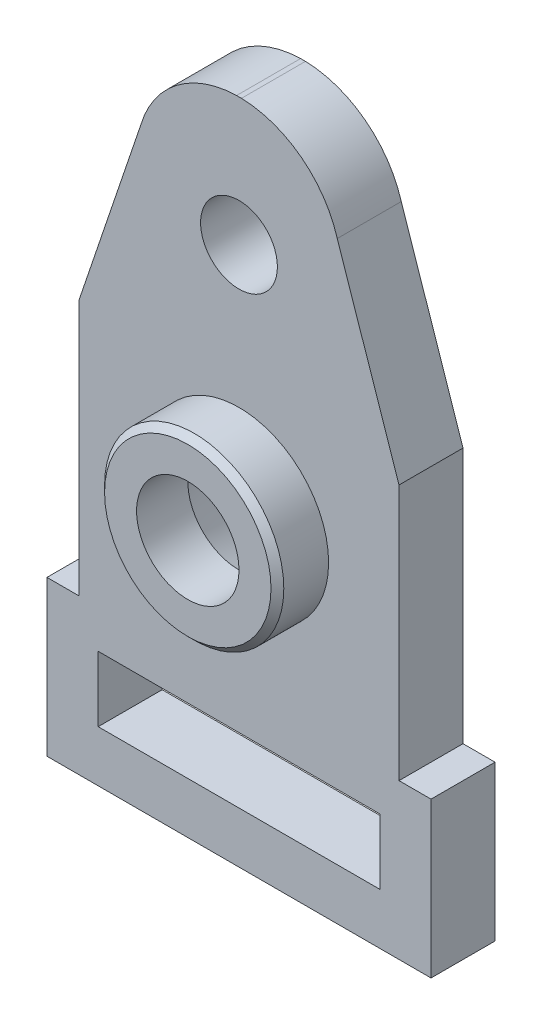
ISO-10303-21;
HEADER;
FILE_DESCRIPTION(('STEP AP214'),'2;1');
FILE_NAME('part.step','',(''),(''),'','','');
FILE_SCHEMA(('AUTOMOTIVE_DESIGN { 1 0 10303 214 1 1 1 1 }'));
ENDSEC;
DATA;
#1=APPLICATION_CONTEXT('core data for automotive mechanical design processes');
#2=APPLICATION_PROTOCOL_DEFINITION('international standard','automotive_design',2000,#1);
#3=PRODUCT_CONTEXT('',#1,'mechanical');
#4=PRODUCT('Part','Part','',(#3));
#5=PRODUCT_RELATED_PRODUCT_CATEGORY('part','',(#4));
#6=PRODUCT_DEFINITION_FORMATION('','',#4);
#7=PRODUCT_DEFINITION_CONTEXT('part definition',#1,'design');
#8=PRODUCT_DEFINITION('design','',#6,#7);
#9=PRODUCT_DEFINITION_SHAPE('','',#8);
#10=(LENGTH_UNIT() NAMED_UNIT(*) SI_UNIT(.MILLI.,.METRE.));
#11=(NAMED_UNIT(*) PLANE_ANGLE_UNIT() SI_UNIT($,.RADIAN.));
#12=(NAMED_UNIT(*) SI_UNIT($,.STERADIAN.) SOLID_ANGLE_UNIT());
#13=UNCERTAINTY_MEASURE_WITH_UNIT(LENGTH_MEASURE(1.E-05),#10,'distance_accuracy_value','');
#14=(GEOMETRIC_REPRESENTATION_CONTEXT(3) GLOBAL_UNCERTAINTY_ASSIGNED_CONTEXT((#13)) GLOBAL_UNIT_ASSIGNED_CONTEXT((#10,
#11,#12)) REPRESENTATION_CONTEXT('',''));
#15=CARTESIAN_POINT('',(0.,0.,0.));
#16=DIRECTION('',(0.,0.,1.));
#17=DIRECTION('',(1.,0.,0.));
#18=AXIS2_PLACEMENT_3D('',#15,#16,#17);
#19=CARTESIAN_POINT('',(0.,0.,5.));
#20=DIRECTION('',(0.,0.,1.));
#21=DIRECTION('',(1.,0.,0.));
#22=AXIS2_PLACEMENT_3D('',#19,#20,#21);
#23=PLANE('',#22);
#24=CARTESIAN_POINT('',(0.,10.,5.));
#25=DIRECTION('',(0.,0.,1.));
#26=DIRECTION('',(1.,0.,0.));
#27=AXIS2_PLACEMENT_3D('',#24,#25,#26);
#28=CIRCLE('',#27,3.);
#29=CARTESIAN_POINT('',(3.,10.,5.));
#30=VERTEX_POINT('',#29);
#31=EDGE_CURVE('E252',#30,#30,#28,.T.);
#32=ORIENTED_EDGE('',*,*,#31,.F.);
#33=EDGE_LOOP('',(#32));
#34=FACE_BOUND('',#33,.T.);
#35=DIRECTION('',(-1.,0.,0.));
#36=VECTOR('',#35,1.);
#37=CARTESIAN_POINT('',(0.,-32.1,5.));
#38=LINE('',#37,#36);
#39=CARTESIAN_POINT('',(15.,-32.1,5.));
#40=VERTEX_POINT('',#39);
#41=CARTESIAN_POINT('',(-15.,-32.1,5.));
#42=VERTEX_POINT('',#41);
#43=EDGE_CURVE('E218',#40,#42,#38,.T.);
#44=ORIENTED_EDGE('',*,*,#43,.F.);
#45=DIRECTION('',(0.,-1.,0.));
#46=VECTOR('',#45,1.);
#47=CARTESIAN_POINT('',(15.,0.,5.));
#48=LINE('',#47,#46);
#49=CARTESIAN_POINT('',(15.,-20.,5.));
#50=VERTEX_POINT('',#49);
#51=EDGE_CURVE('E349',#50,#40,#48,.T.);
#52=ORIENTED_EDGE('',*,*,#51,.F.);
#53=DIRECTION('',(-1.,0.,0.));
#54=VECTOR('',#53,1.);
#55=CARTESIAN_POINT('',(0.,-20.,5.));
#56=LINE('',#55,#54);
#57=CARTESIAN_POINT('',(12.5,-20.,5.));
#58=VERTEX_POINT('',#57);
#59=EDGE_CURVE('E350',#50,#58,#56,.T.);
#60=ORIENTED_EDGE('',*,*,#59,.T.);
#61=DIRECTION('',(0.,-1.,0.));
#62=VECTOR('',#61,1.);
#63=CARTESIAN_POINT('',(12.5,0.,5.));
#64=LINE('',#63,#62);
#65=CARTESIAN_POINT('',(12.5,0.,5.));
#66=VERTEX_POINT('',#65);
#67=EDGE_CURVE('E352',#66,#58,#64,.T.);
#68=ORIENTED_EDGE('',*,*,#67,.F.);
#69=DIRECTION('',(-0.32052102488142,0.947241401443668,0.));
#70=VECTOR('',#69,1.);
#71=CARTESIAN_POINT('',(11.215828407612,3.79513481001046,5.));
#72=LINE('',#71,#70);
#73=CARTESIAN_POINT('',(7.67486774506854,14.2597979056233,5.));
#74=VERTEX_POINT('',#73);
#75=EDGE_CURVE('E360',#66,#74,#72,.T.);
#76=ORIENTED_EDGE('',*,*,#75,.T.);
#77=CARTESIAN_POINT('',(0.,12.0022760129927,5.));
#78=DIRECTION('',(0.,0.,1.));
#79=DIRECTION('',(1.,0.,0.));
#80=AXIS2_PLACEMENT_3D('',#77,#78,#79);
#81=CIRCLE('',#80,8.);
#82=CARTESIAN_POINT('',(0.190816738386861,20.,5.));
#83=VERTEX_POINT('',#82);
#84=EDGE_CURVE('E362',#74,#83,#81,.T.);
#85=ORIENTED_EDGE('',*,*,#84,.T.);
#86=DIRECTION('',(-1.,0.,0.));
#87=VECTOR('',#86,1.);
#88=CARTESIAN_POINT('',(0.,20.,5.));
#89=LINE('',#88,#87);
#90=CARTESIAN_POINT('',(-0.190816738386866,20.,5.));
#91=VERTEX_POINT('',#90);
#92=EDGE_CURVE('E364',#83,#91,#89,.T.);
#93=ORIENTED_EDGE('',*,*,#92,.T.);
#94=CARTESIAN_POINT('',(-7.67486774506853,14.2597979056234,5.));
#95=VERTEX_POINT('',#94);
#96=EDGE_CURVE('E365',#91,#95,#81,.T.);
#97=ORIENTED_EDGE('',*,*,#96,.T.);
#98=DIRECTION('',(0.32052102488142,0.947241401443668,0.));
#99=VECTOR('',#98,1.);
#100=CARTESIAN_POINT('',(-11.2158284076121,3.79513481001046,5.));
#101=LINE('',#100,#99);
#102=CARTESIAN_POINT('',(-12.5,0.,5.));
#103=VERTEX_POINT('',#102);
#104=EDGE_CURVE('E367',#103,#95,#101,.T.);
#105=ORIENTED_EDGE('',*,*,#104,.F.);
#106=DIRECTION('',(0.,-1.,0.));
#107=VECTOR('',#106,1.);
#108=CARTESIAN_POINT('',(-12.5,0.,5.));
#109=LINE('',#108,#107);
#110=CARTESIAN_POINT('',(-12.5,-20.,5.));
#111=VERTEX_POINT('',#110);
#112=EDGE_CURVE('E370',#103,#111,#109,.T.);
#113=ORIENTED_EDGE('',*,*,#112,.T.);
#114=CARTESIAN_POINT('',(-15.,-20.,5.));
#115=VERTEX_POINT('',#114);
#116=EDGE_CURVE('E354',#111,#115,#56,.T.);
#117=ORIENTED_EDGE('',*,*,#116,.T.);
#118=DIRECTION('',(0.,-1.,0.));
#119=VECTOR('',#118,1.);
#120=CARTESIAN_POINT('',(-15.,0.,5.));
#121=LINE('',#120,#119);
#122=EDGE_CURVE('E372',#115,#42,#121,.T.);
#123=ORIENTED_EDGE('',*,*,#122,.T.);
#124=EDGE_LOOP('',(#44,#52,#60,#68,#76,#85,#93,#97,#105,#113,#117,#123));
#125=FACE_BOUND('',#124,.T.);
#126=DIRECTION('',(0.,-1.,0.));
#127=VECTOR('',#126,1.);
#128=CARTESIAN_POINT('',(11.0000000000005,-2.24493626302891E-13,5.));
#129=LINE('',#128,#127);
#130=CARTESIAN_POINT('',(11.,-23.,5.));
#131=VERTEX_POINT('',#130);
#132=CARTESIAN_POINT('',(11.,-28.1,5.));
#133=VERTEX_POINT('',#132);
#134=EDGE_CURVE('E173',#131,#133,#129,.T.);
#135=ORIENTED_EDGE('',*,*,#134,.T.);
#136=DIRECTION('',(1.,0.,0.));
#137=VECTOR('',#136,1.);
#138=CARTESIAN_POINT('',(0.,-28.1,5.));
#139=LINE('',#138,#137);
#140=CARTESIAN_POINT('',(-11.,-28.1,5.));
#141=VERTEX_POINT('',#140);
#142=EDGE_CURVE('E161',#141,#133,#139,.T.);
#143=ORIENTED_EDGE('',*,*,#142,.F.);
#144=DIRECTION('',(0.,-1.,0.));
#145=VECTOR('',#144,1.);
#146=CARTESIAN_POINT('',(-11.,0.,5.));
#147=LINE('',#146,#145);
#148=CARTESIAN_POINT('',(-11.,-23.,5.));
#149=VERTEX_POINT('',#148);
#150=EDGE_CURVE('E171',#149,#141,#147,.T.);
#151=ORIENTED_EDGE('',*,*,#150,.F.);
#152=DIRECTION('',(1.,0.,0.));
#153=VECTOR('',#152,1.);
#154=CARTESIAN_POINT('',(0.,-23.,5.));
#155=LINE('',#154,#153);
#156=EDGE_CURVE('E55',#149,#131,#155,.T.);
#157=ORIENTED_EDGE('',*,*,#156,.T.);
#158=EDGE_LOOP('',(#135,#143,#151,#157));
#159=FACE_BOUND('',#158,.T.);
#160=CARTESIAN_POINT('',(0.,-8.,5.));
#161=DIRECTION('',(0.,0.,1.));
#162=DIRECTION('',(1.,0.,0.));
#163=AXIS2_PLACEMENT_3D('',#160,#161,#162);
#164=CIRCLE('',#163,7.);
#165=CARTESIAN_POINT('',(7.,-8.,5.));
#166=VERTEX_POINT('',#165);
#167=EDGE_CURVE('E579',#166,#166,#164,.T.);
#168=ORIENTED_EDGE('',*,*,#167,.F.);
#169=EDGE_LOOP('',(#168));
#170=FACE_BOUND('',#169,.T.);
#171=ADVANCED_FACE('F37',(#34,#125,#159,#170),#23,.T.);
#172=CARTESIAN_POINT('',(11.0000000000005,-2.24493626302891E-13,5.));
#173=DIRECTION('',(1.,0.,0.));
#174=DIRECTION('',(0.,1.,0.));
#175=AXIS2_PLACEMENT_3D('',#172,#173,#174);
#176=PLANE('',#175);
#177=DIRECTION('',(0.,-1.,0.));
#178=VECTOR('',#177,1.);
#179=CARTESIAN_POINT('',(11.0000000000005,-2.24493626302891E-13,0.));
#180=LINE('',#179,#178);
#181=CARTESIAN_POINT('',(11.,-23.,0.));
#182=VERTEX_POINT('',#181);
#183=CARTESIAN_POINT('',(11.,-28.1,0.));
#184=VERTEX_POINT('',#183);
#185=EDGE_CURVE('E211',#182,#184,#180,.T.);
#186=ORIENTED_EDGE('',*,*,#185,.T.);
#187=DIRECTION('',(0.,0.,-1.));
#188=VECTOR('',#187,1.);
#189=CARTESIAN_POINT('',(11.,-28.1,5.));
#190=LINE('',#189,#188);
#191=EDGE_CURVE('E168',#133,#184,#190,.T.);
#192=ORIENTED_EDGE('',*,*,#191,.F.);
#193=ORIENTED_EDGE('',*,*,#134,.F.);
#194=DIRECTION('',(0.,0.,-1.));
#195=VECTOR('',#194,1.);
#196=CARTESIAN_POINT('',(11.,-23.,5.));
#197=LINE('',#196,#195);
#198=EDGE_CURVE('E219',#131,#182,#197,.T.);
#199=ORIENTED_EDGE('',*,*,#198,.T.);
#200=EDGE_LOOP('',(#186,#192,#193,#199));
#201=FACE_BOUND('',#200,.T.);
#202=ADVANCED_FACE('F274',(#201),#176,.F.);
#203=CARTESIAN_POINT('',(0.,-28.1,5.));
#204=DIRECTION('',(0.,1.,0.));
#205=DIRECTION('',(0.,0.,1.));
#206=AXIS2_PLACEMENT_3D('',#203,#204,#205);
#207=PLANE('',#206);
#208=DIRECTION('',(1.,0.,0.));
#209=VECTOR('',#208,1.);
#210=CARTESIAN_POINT('',(0.,-28.1,0.));
#211=LINE('',#210,#209);
#212=CARTESIAN_POINT('',(-11.,-28.1,0.));
#213=VERTEX_POINT('',#212);
#214=EDGE_CURVE('E163',#213,#184,#211,.T.);
#215=ORIENTED_EDGE('',*,*,#214,.F.);
#216=DIRECTION('',(0.,0.,-1.));
#217=VECTOR('',#216,1.);
#218=CARTESIAN_POINT('',(-11.,-28.1,5.));
#219=LINE('',#218,#217);
#220=EDGE_CURVE('E158',#141,#213,#219,.T.);
#221=ORIENTED_EDGE('',*,*,#220,.F.);
#222=ORIENTED_EDGE('',*,*,#142,.T.);
#223=ORIENTED_EDGE('',*,*,#191,.T.);
#224=EDGE_LOOP('',(#215,#221,#222,#223));
#225=FACE_BOUND('',#224,.T.);
#226=ADVANCED_FACE('F160',(#225),#207,.T.);
#227=CARTESIAN_POINT('',(-11.,0.,5.));
#228=DIRECTION('',(1.,0.,0.));
#229=DIRECTION('',(0.,0.,-1.));
#230=AXIS2_PLACEMENT_3D('',#227,#228,#229);
#231=PLANE('',#230);
#232=DIRECTION('',(0.,-1.,0.));
#233=VECTOR('',#232,1.);
#234=CARTESIAN_POINT('',(-11.,0.,0.));
#235=LINE('',#234,#233);
#236=CARTESIAN_POINT('',(-11.,-23.,0.));
#237=VERTEX_POINT('',#236);
#238=EDGE_CURVE('E215',#237,#213,#235,.T.);
#239=ORIENTED_EDGE('',*,*,#238,.F.);
#240=DIRECTION('',(0.,0.,-1.));
#241=VECTOR('',#240,1.);
#242=CARTESIAN_POINT('',(-11.,-23.,5.));
#243=LINE('',#242,#241);
#244=EDGE_CURVE('E107',#149,#237,#243,.T.);
#245=ORIENTED_EDGE('',*,*,#244,.F.);
#246=ORIENTED_EDGE('',*,*,#150,.T.);
#247=ORIENTED_EDGE('',*,*,#220,.T.);
#248=EDGE_LOOP('',(#239,#245,#246,#247));
#249=FACE_BOUND('',#248,.T.);
#250=ADVANCED_FACE('F176',(#249),#231,.T.);
#251=CARTESIAN_POINT('',(0.,-32.1,5.));
#252=DIRECTION('',(0.,-1.,0.));
#253=DIRECTION('',(1.,0.,0.));
#254=AXIS2_PLACEMENT_3D('',#251,#252,#253);
#255=PLANE('',#254);
#256=DIRECTION('',(-1.,0.,0.));
#257=VECTOR('',#256,1.);
#258=CARTESIAN_POINT('',(0.,-32.1,0.));
#259=LINE('',#258,#257);
#260=CARTESIAN_POINT('',(15.,-32.1,0.));
#261=VERTEX_POINT('',#260);
#262=CARTESIAN_POINT('',(-15.,-32.1,0.));
#263=VERTEX_POINT('',#262);
#264=EDGE_CURVE('E182',#261,#263,#259,.T.);
#265=ORIENTED_EDGE('',*,*,#264,.F.);
#266=DIRECTION('',(0.,0.,-1.));
#267=VECTOR('',#266,1.);
#268=CARTESIAN_POINT('',(15.,-32.1,5.));
#269=LINE('',#268,#267);
#270=EDGE_CURVE('E118',#40,#261,#269,.T.);
#271=ORIENTED_EDGE('',*,*,#270,.F.);
#272=ORIENTED_EDGE('',*,*,#43,.T.);
#273=DIRECTION('',(0.,0.,-1.));
#274=VECTOR('',#273,1.);
#275=CARTESIAN_POINT('',(-15.,-32.1,5.));
#276=LINE('',#275,#274);
#277=EDGE_CURVE('E178',#42,#263,#276,.T.);
#278=ORIENTED_EDGE('',*,*,#277,.T.);
#279=EDGE_LOOP('',(#265,#271,#272,#278));
#280=FACE_BOUND('',#279,.T.);
#281=ADVANCED_FACE('F298',(#280),#255,.T.);
#282=CARTESIAN_POINT('',(15.,0.,5.));
#283=DIRECTION('',(1.,0.,0.));
#284=DIRECTION('',(0.,1.,0.));
#285=AXIS2_PLACEMENT_3D('',#282,#283,#284);
#286=PLANE('',#285);
#287=DIRECTION('',(0.,-1.,0.));
#288=VECTOR('',#287,1.);
#289=CARTESIAN_POINT('',(15.,0.,0.));
#290=LINE('',#289,#288);
#291=CARTESIAN_POINT('',(15.,-20.,0.));
#292=VERTEX_POINT('',#291);
#293=EDGE_CURVE('E185',#292,#261,#290,.T.);
#294=ORIENTED_EDGE('',*,*,#293,.F.);
#295=DIRECTION('',(0.,0.,-1.));
#296=VECTOR('',#295,1.);
#297=CARTESIAN_POINT('',(15.,-20.,5.));
#298=LINE('',#297,#296);
#299=EDGE_CURVE('E247',#50,#292,#298,.T.);
#300=ORIENTED_EDGE('',*,*,#299,.F.);
#301=ORIENTED_EDGE('',*,*,#51,.T.);
#302=ORIENTED_EDGE('',*,*,#270,.T.);
#303=EDGE_LOOP('',(#294,#300,#301,#302));
#304=FACE_BOUND('',#303,.T.);
#305=ADVANCED_FACE('F334',(#304),#286,.T.);
#306=CARTESIAN_POINT('',(0.,-20.,5.));
#307=DIRECTION('',(0.,-1.,0.));
#308=DIRECTION('',(1.,0.,0.));
#309=AXIS2_PLACEMENT_3D('',#306,#307,#308);
#310=PLANE('',#309);
#311=DIRECTION('',(-1.,0.,0.));
#312=VECTOR('',#311,1.);
#313=CARTESIAN_POINT('',(0.,-20.,0.));
#314=LINE('',#313,#312);
#315=CARTESIAN_POINT('',(12.5,-20.,0.));
#316=VERTEX_POINT('',#315);
#317=EDGE_CURVE('E189',#292,#316,#314,.T.);
#318=ORIENTED_EDGE('',*,*,#317,.T.);
#319=DIRECTION('',(0.,0.,-1.));
#320=VECTOR('',#319,1.);
#321=CARTESIAN_POINT('',(12.5,-20.,5.));
#322=LINE('',#321,#320);
#323=EDGE_CURVE('E245',#58,#316,#322,.T.);
#324=ORIENTED_EDGE('',*,*,#323,.F.);
#325=ORIENTED_EDGE('',*,*,#59,.F.);
#326=ORIENTED_EDGE('',*,*,#299,.T.);
#327=EDGE_LOOP('',(#318,#324,#325,#326));
#328=FACE_BOUND('',#327,.T.);
#329=ADVANCED_FACE('F309',(#328),#310,.F.);
#330=CARTESIAN_POINT('',(12.5,0.,5.));
#331=DIRECTION('',(1.,0.,0.));
#332=DIRECTION('',(0.,1.,0.));
#333=AXIS2_PLACEMENT_3D('',#330,#331,#332);
#334=PLANE('',#333);
#335=DIRECTION('',(0.,-1.,0.));
#336=VECTOR('',#335,1.);
#337=CARTESIAN_POINT('',(12.5,0.,0.));
#338=LINE('',#337,#336);
#339=CARTESIAN_POINT('',(12.5,0.,0.));
#340=VERTEX_POINT('',#339);
#341=EDGE_CURVE('E192',#340,#316,#338,.T.);
#342=ORIENTED_EDGE('',*,*,#341,.F.);
#343=DIRECTION('',(0.,0.,-1.));
#344=VECTOR('',#343,1.);
#345=CARTESIAN_POINT('',(12.5,0.,5.));
#346=LINE('',#345,#344);
#347=EDGE_CURVE('E243',#66,#340,#346,.T.);
#348=ORIENTED_EDGE('',*,*,#347,.F.);
#349=ORIENTED_EDGE('',*,*,#67,.T.);
#350=ORIENTED_EDGE('',*,*,#323,.T.);
#351=EDGE_LOOP('',(#342,#348,#349,#350));
#352=FACE_BOUND('',#351,.T.);
#353=ADVANCED_FACE('F329',(#352),#334,.T.);
#354=CARTESIAN_POINT('',(11.215828407612,3.79513481001046,5.));
#355=DIRECTION('',(-0.947241401443668,-0.32052102488142,0.));
#356=DIRECTION('',(0.32052102488142,-0.947241401443668,0.));
#357=AXIS2_PLACEMENT_3D('',#354,#355,#356);
#358=PLANE('',#357);
#359=DIRECTION('',(-0.32052102488142,0.947241401443668,0.));
#360=VECTOR('',#359,1.);
#361=CARTESIAN_POINT('',(11.215828407612,3.79513481001046,0.));
#362=LINE('',#361,#360);
#363=CARTESIAN_POINT('',(7.67486774506854,14.2597979056233,0.));
#364=VERTEX_POINT('',#363);
#365=EDGE_CURVE('E196',#340,#364,#362,.T.);
#366=ORIENTED_EDGE('',*,*,#365,.T.);
#367=DIRECTION('',(0.,0.,-1.));
#368=VECTOR('',#367,1.);
#369=CARTESIAN_POINT('',(7.67486774506854,14.2597979056233,5.));
#370=LINE('',#369,#368);
#371=EDGE_CURVE('E240',#74,#364,#370,.T.);
#372=ORIENTED_EDGE('',*,*,#371,.F.);
#373=ORIENTED_EDGE('',*,*,#75,.F.);
#374=ORIENTED_EDGE('',*,*,#347,.T.);
#375=EDGE_LOOP('',(#366,#372,#373,#374));
#376=FACE_BOUND('',#375,.T.);
#377=ADVANCED_FACE('F326',(#376),#358,.F.);
#378=CARTESIAN_POINT('',(0.,12.0022760129927,5.));
#379=DIRECTION('',(0.,0.,-1.));
#380=DIRECTION('',(-1.,0.,0.));
#381=AXIS2_PLACEMENT_3D('',#378,#379,#380);
#382=CYLINDRICAL_SURFACE('',#381,8.);
#383=CARTESIAN_POINT('',(0.,12.0022760129927,0.));
#384=DIRECTION('',(0.,0.,1.));
#385=DIRECTION('',(1.,0.,0.));
#386=AXIS2_PLACEMENT_3D('',#383,#384,#385);
#387=CIRCLE('',#386,8.);
#388=CARTESIAN_POINT('',(0.190816738386861,20.,0.));
#389=VERTEX_POINT('',#388);
#390=EDGE_CURVE('E198',#364,#389,#387,.T.);
#391=ORIENTED_EDGE('',*,*,#390,.T.);
#392=DIRECTION('',(0.,0.,-1.));
#393=VECTOR('',#392,1.);
#394=CARTESIAN_POINT('',(0.190816738386861,20.,5.));
#395=LINE('',#394,#393);
#396=EDGE_CURVE('E237',#83,#389,#395,.T.);
#397=ORIENTED_EDGE('',*,*,#396,.F.);
#398=ORIENTED_EDGE('',*,*,#84,.F.);
#399=ORIENTED_EDGE('',*,*,#371,.T.);
#400=EDGE_LOOP('',(#391,#397,#398,#399));
#401=FACE_BOUND('',#400,.T.);
#402=ADVANCED_FACE('F322',(#401),#382,.T.);
#403=CARTESIAN_POINT('',(0.,20.,5.));
#404=DIRECTION('',(0.,-1.,0.));
#405=DIRECTION('',(0.,0.,-1.));
#406=AXIS2_PLACEMENT_3D('',#403,#404,#405);
#407=PLANE('',#406);
#408=DIRECTION('',(-1.,0.,0.));
#409=VECTOR('',#408,1.);
#410=CARTESIAN_POINT('',(0.,20.,0.));
#411=LINE('',#410,#409);
#412=CARTESIAN_POINT('',(-0.190816738386866,20.,0.));
#413=VERTEX_POINT('',#412);
#414=EDGE_CURVE('E200',#389,#413,#411,.T.);
#415=ORIENTED_EDGE('',*,*,#414,.T.);
#416=DIRECTION('',(0.,0.,-1.));
#417=VECTOR('',#416,1.);
#418=CARTESIAN_POINT('',(-0.190816738386866,20.,5.));
#419=LINE('',#418,#417);
#420=EDGE_CURVE('E234',#91,#413,#419,.T.);
#421=ORIENTED_EDGE('',*,*,#420,.F.);
#422=ORIENTED_EDGE('',*,*,#92,.F.);
#423=ORIENTED_EDGE('',*,*,#396,.T.);
#424=EDGE_LOOP('',(#415,#421,#422,#423));
#425=FACE_BOUND('',#424,.T.);
#426=ADVANCED_FACE('F320',(#425),#407,.F.);
#427=CARTESIAN_POINT('',(-7.67486774506853,14.2597979056234,0.));
#428=VERTEX_POINT('',#427);
#429=EDGE_CURVE('E201',#413,#428,#387,.T.);
#430=ORIENTED_EDGE('',*,*,#429,.T.);
#431=DIRECTION('',(0.,0.,-1.));
#432=VECTOR('',#431,1.);
#433=CARTESIAN_POINT('',(-7.67486774506853,14.2597979056234,5.));
#434=LINE('',#433,#432);
#435=EDGE_CURVE('E232',#95,#428,#434,.T.);
#436=ORIENTED_EDGE('',*,*,#435,.F.);
#437=ORIENTED_EDGE('',*,*,#96,.F.);
#438=ORIENTED_EDGE('',*,*,#420,.T.);
#439=EDGE_LOOP('',(#430,#436,#437,#438));
#440=FACE_BOUND('',#439,.T.);
#441=ADVANCED_FACE('F316',(#440),#382,.T.);
#442=CARTESIAN_POINT('',(-11.2158284076121,3.79513481001046,5.));
#443=DIRECTION('',(-0.947241401443668,0.32052102488142,0.));
#444=DIRECTION('',(-0.32052102488142,-0.947241401443668,0.));
#445=AXIS2_PLACEMENT_3D('',#442,#443,#444);
#446=PLANE('',#445);
#447=DIRECTION('',(0.32052102488142,0.947241401443668,0.));
#448=VECTOR('',#447,1.);
#449=CARTESIAN_POINT('',(-11.2158284076121,3.79513481001046,0.));
#450=LINE('',#449,#448);
#451=CARTESIAN_POINT('',(-12.5,0.,0.));
#452=VERTEX_POINT('',#451);
#453=EDGE_CURVE('E203',#452,#428,#450,.T.);
#454=ORIENTED_EDGE('',*,*,#453,.F.);
#455=DIRECTION('',(0.,0.,-1.));
#456=VECTOR('',#455,1.);
#457=CARTESIAN_POINT('',(-12.5,0.,5.));
#458=LINE('',#457,#456);
#459=EDGE_CURVE('E230',#103,#452,#458,.T.);
#460=ORIENTED_EDGE('',*,*,#459,.F.);
#461=ORIENTED_EDGE('',*,*,#104,.T.);
#462=ORIENTED_EDGE('',*,*,#435,.T.);
#463=EDGE_LOOP('',(#454,#460,#461,#462));
#464=FACE_BOUND('',#463,.T.);
#465=ADVANCED_FACE('F312',(#464),#446,.T.);
#466=CARTESIAN_POINT('',(-12.5,0.,5.));
#467=DIRECTION('',(1.,0.,0.));
#468=DIRECTION('',(0.,1.,0.));
#469=AXIS2_PLACEMENT_3D('',#466,#467,#468);
#470=PLANE('',#469);
#471=DIRECTION('',(0.,-1.,0.));
#472=VECTOR('',#471,1.);
#473=CARTESIAN_POINT('',(-12.5,0.,0.));
#474=LINE('',#473,#472);
#475=CARTESIAN_POINT('',(-12.5,-20.,0.));
#476=VERTEX_POINT('',#475);
#477=EDGE_CURVE('E206',#452,#476,#474,.T.);
#478=ORIENTED_EDGE('',*,*,#477,.T.);
#479=DIRECTION('',(0.,0.,-1.));
#480=VECTOR('',#479,1.);
#481=CARTESIAN_POINT('',(-12.5,-20.,5.));
#482=LINE('',#481,#480);
#483=EDGE_CURVE('E227',#111,#476,#482,.T.);
#484=ORIENTED_EDGE('',*,*,#483,.F.);
#485=ORIENTED_EDGE('',*,*,#112,.F.);
#486=ORIENTED_EDGE('',*,*,#459,.T.);
#487=EDGE_LOOP('',(#478,#484,#485,#486));
#488=FACE_BOUND('',#487,.T.);
#489=ADVANCED_FACE('F307',(#488),#470,.F.);
#490=CARTESIAN_POINT('',(-15.,-20.,0.));
#491=VERTEX_POINT('',#490);
#492=EDGE_CURVE('E193',#476,#491,#314,.T.);
#493=ORIENTED_EDGE('',*,*,#492,.T.);
#494=DIRECTION('',(0.,0.,-1.));
#495=VECTOR('',#494,1.);
#496=CARTESIAN_POINT('',(-15.,-20.,5.));
#497=LINE('',#496,#495);
#498=EDGE_CURVE('E224',#115,#491,#497,.T.);
#499=ORIENTED_EDGE('',*,*,#498,.F.);
#500=ORIENTED_EDGE('',*,*,#116,.F.);
#501=ORIENTED_EDGE('',*,*,#483,.T.);
#502=EDGE_LOOP('',(#493,#499,#500,#501));
#503=FACE_BOUND('',#502,.T.);
#504=ADVANCED_FACE('F303',(#503),#310,.F.);
#505=CARTESIAN_POINT('',(-15.,0.,5.));
#506=DIRECTION('',(1.,0.,0.));
#507=DIRECTION('',(0.,1.,0.));
#508=AXIS2_PLACEMENT_3D('',#505,#506,#507);
#509=PLANE('',#508);
#510=DIRECTION('',(0.,-1.,0.));
#511=VECTOR('',#510,1.);
#512=CARTESIAN_POINT('',(-15.,0.,0.));
#513=LINE('',#512,#511);
#514=EDGE_CURVE('E208',#491,#263,#513,.T.);
#515=ORIENTED_EDGE('',*,*,#514,.T.);
#516=ORIENTED_EDGE('',*,*,#277,.F.);
#517=ORIENTED_EDGE('',*,*,#122,.F.);
#518=ORIENTED_EDGE('',*,*,#498,.T.);
#519=EDGE_LOOP('',(#515,#516,#517,#518));
#520=FACE_BOUND('',#519,.T.);
#521=ADVANCED_FACE('F295',(#520),#509,.F.);
#522=CARTESIAN_POINT('',(0.,-23.,5.));
#523=DIRECTION('',(0.,1.,0.));
#524=DIRECTION('',(0.,0.,1.));
#525=AXIS2_PLACEMENT_3D('',#522,#523,#524);
#526=PLANE('',#525);
#527=DIRECTION('',(1.,0.,0.));
#528=VECTOR('',#527,1.);
#529=CARTESIAN_POINT('',(0.,-23.,0.));
#530=LINE('',#529,#528);
#531=EDGE_CURVE('E110',#237,#182,#530,.T.);
#532=ORIENTED_EDGE('',*,*,#531,.T.);
#533=ORIENTED_EDGE('',*,*,#198,.F.);
#534=ORIENTED_EDGE('',*,*,#156,.F.);
#535=ORIENTED_EDGE('',*,*,#244,.T.);
#536=EDGE_LOOP('',(#532,#533,#534,#535));
#537=FACE_BOUND('',#536,.T.);
#538=ADVANCED_FACE('F291',(#537),#526,.F.);
#539=CARTESIAN_POINT('',(0.,0.,0.));
#540=DIRECTION('',(0.,0.,1.));
#541=DIRECTION('',(1.,0.,0.));
#542=AXIS2_PLACEMENT_3D('',#539,#540,#541);
#543=PLANE('',#542);
#544=CARTESIAN_POINT('',(0.,-8.,0.));
#545=DIRECTION('',(0.,0.,1.));
#546=DIRECTION('',(1.,0.,0.));
#547=AXIS2_PLACEMENT_3D('',#544,#545,#546);
#548=CIRCLE('',#547,5.81985117133101);
#549=CARTESIAN_POINT('',(5.81985117133101,-8.,0.));
#550=VERTEX_POINT('',#549);
#551=EDGE_CURVE('E41',#550,#550,#548,.T.);
#552=ORIENTED_EDGE('',*,*,#551,.T.);
#553=EDGE_LOOP('',(#552));
#554=FACE_BOUND('',#553,.T.);
#555=CARTESIAN_POINT('',(0.,10.,0.));
#556=DIRECTION('',(0.,0.,1.));
#557=DIRECTION('',(1.,0.,0.));
#558=AXIS2_PLACEMENT_3D('',#555,#556,#557);
#559=CIRCLE('',#558,3.);
#560=CARTESIAN_POINT('',(3.,10.,0.));
#561=VERTEX_POINT('',#560);
#562=EDGE_CURVE('E186',#561,#561,#559,.T.);
#563=ORIENTED_EDGE('',*,*,#562,.T.);
#564=EDGE_LOOP('',(#563));
#565=FACE_BOUND('',#564,.T.);
#566=ORIENTED_EDGE('',*,*,#264,.T.);
#567=ORIENTED_EDGE('',*,*,#514,.F.);
#568=ORIENTED_EDGE('',*,*,#492,.F.);
#569=ORIENTED_EDGE('',*,*,#477,.F.);
#570=ORIENTED_EDGE('',*,*,#453,.T.);
#571=ORIENTED_EDGE('',*,*,#429,.F.);
#572=ORIENTED_EDGE('',*,*,#414,.F.);
#573=ORIENTED_EDGE('',*,*,#390,.F.);
#574=ORIENTED_EDGE('',*,*,#365,.F.);
#575=ORIENTED_EDGE('',*,*,#341,.T.);
#576=ORIENTED_EDGE('',*,*,#317,.F.);
#577=ORIENTED_EDGE('',*,*,#293,.T.);
#578=EDGE_LOOP('',(#566,#567,#568,#569,#570,#571,#572,#573,#574,#575,#576,#577));
#579=FACE_BOUND('',#578,.T.);
#580=ORIENTED_EDGE('',*,*,#185,.F.);
#581=ORIENTED_EDGE('',*,*,#531,.F.);
#582=ORIENTED_EDGE('',*,*,#238,.T.);
#583=ORIENTED_EDGE('',*,*,#214,.T.);
#584=EDGE_LOOP('',(#580,#581,#582,#583));
#585=FACE_BOUND('',#584,.T.);
#586=ADVANCED_FACE('F288',(#554,#565,#579,#585),#543,.F.);
#587=CARTESIAN_POINT('',(0.,10.,-5.));
#588=DIRECTION('',(0.,0.,1.));
#589=DIRECTION('',(1.,0.,0.));
#590=AXIS2_PLACEMENT_3D('',#587,#588,#589);
#591=CYLINDRICAL_SURFACE('',#590,3.);
#592=ORIENTED_EDGE('',*,*,#31,.T.);
#593=EDGE_LOOP('',(#592));
#594=FACE_BOUND('',#593,.T.);
#595=ORIENTED_EDGE('',*,*,#562,.F.);
#596=EDGE_LOOP('',(#595));
#597=FACE_BOUND('',#596,.T.);
#598=ADVANCED_FACE('F286',(#594,#597),#591,.F.);
#599=CARTESIAN_POINT('',(0.,-8.,9.));
#600=DIRECTION('',(0.,0.,1.));
#601=DIRECTION('',(1.,0.,0.));
#602=AXIS2_PLACEMENT_3D('',#599,#600,#601);
#603=PLANE('',#602);
#604=CARTESIAN_POINT('',(0.,-8.,9.));
#605=DIRECTION('',(0.,0.,1.));
#606=DIRECTION('',(1.,0.,0.));
#607=AXIS2_PLACEMENT_3D('',#604,#605,#606);
#608=CIRCLE('',#607,6.5);
#609=CARTESIAN_POINT('',(6.5,-8.,9.));
#610=VERTEX_POINT('',#609);
#611=EDGE_CURVE('E47',#610,#610,#608,.T.);
#612=ORIENTED_EDGE('',*,*,#611,.T.);
#613=EDGE_LOOP('',(#612));
#614=FACE_BOUND('',#613,.T.);
#615=CARTESIAN_POINT('',(0.,-8.,9.));
#616=DIRECTION('',(0.,0.,1.));
#617=DIRECTION('',(1.,0.,0.));
#618=AXIS2_PLACEMENT_3D('',#615,#616,#617);
#619=CIRCLE('',#618,4.);
#620=CARTESIAN_POINT('',(4.,-8.,9.));
#621=VERTEX_POINT('',#620);
#622=EDGE_CURVE('E580',#621,#621,#619,.T.);
#623=ORIENTED_EDGE('',*,*,#622,.F.);
#624=EDGE_LOOP('',(#623));
#625=FACE_BOUND('',#624,.T.);
#626=ADVANCED_FACE('F256',(#614,#625),#603,.T.);
#627=CARTESIAN_POINT('',(0.,-8.,9.));
#628=DIRECTION('',(0.,0.,-1.));
#629=DIRECTION('',(-1.,0.,0.));
#630=AXIS2_PLACEMENT_3D('',#627,#628,#629);
#631=CYLINDRICAL_SURFACE('',#630,7.);
#632=CARTESIAN_POINT('',(0.,-8.,8.5));
#633=DIRECTION('',(0.,0.,1.));
#634=DIRECTION('',(1.,0.,0.));
#635=AXIS2_PLACEMENT_3D('',#632,#633,#634);
#636=CIRCLE('',#635,7.);
#637=CARTESIAN_POINT('',(7.,-8.,8.5));
#638=VERTEX_POINT('',#637);
#639=EDGE_CURVE('E11',#638,#638,#636,.F.);
#640=ORIENTED_EDGE('',*,*,#639,.T.);
#641=EDGE_LOOP('',(#640));
#642=FACE_BOUND('',#641,.T.);
#643=ORIENTED_EDGE('',*,*,#167,.T.);
#644=EDGE_LOOP('',(#643));
#645=FACE_BOUND('',#644,.T.);
#646=ADVANCED_FACE('F269',(#642,#645),#631,.T.);
#647=CARTESIAN_POINT('',(0.,-8.,9.));
#648=DIRECTION('',(0.,0.,-1.));
#649=DIRECTION('',(-1.,0.,0.));
#650=AXIS2_PLACEMENT_3D('',#647,#648,#649);
#651=CYLINDRICAL_SURFACE('',#650,4.);
#652=ORIENTED_EDGE('',*,*,#622,.T.);
#653=EDGE_LOOP('',(#652));
#654=FACE_BOUND('',#653,.T.);
#655=CARTESIAN_POINT('',(0.,-8.,5.));
#656=DIRECTION('',(0.,0.,1.));
#657=DIRECTION('',(1.,0.,0.));
#658=AXIS2_PLACEMENT_3D('',#655,#656,#657);
#659=CIRCLE('',#658,4.);
#660=CARTESIAN_POINT('',(4.,-8.,5.));
#661=VERTEX_POINT('',#660);
#662=EDGE_CURVE('E586',#661,#661,#659,.T.);
#663=ORIENTED_EDGE('',*,*,#662,.F.);
#664=EDGE_LOOP('',(#663));
#665=FACE_BOUND('',#664,.T.);
#666=ADVANCED_FACE('F261',(#654,#665),#651,.F.);
#667=CARTESIAN_POINT('',(0.,-8.,9.));
#668=DIRECTION('',(0.,0.,-1.));
#669=DIRECTION('',(-1.,0.,0.));
#670=AXIS2_PLACEMENT_3D('',#667,#668,#669);
#671=CONICAL_SURFACE('',#670,6.5,0.785398163397446);
#672=ORIENTED_EDGE('',*,*,#639,.F.);
#673=EDGE_LOOP('',(#672));
#674=FACE_BOUND('',#673,.T.);
#675=ORIENTED_EDGE('',*,*,#611,.F.);
#676=EDGE_LOOP('',(#675));
#677=FACE_BOUND('',#676,.T.);
#678=ADVANCED_FACE('F39',(#674,#677),#671,.T.);
#679=CARTESIAN_POINT('',(0.,-8.,5.));
#680=DIRECTION('',(0.,0.,-1.));
#681=DIRECTION('',(1.,0.,0.));
#682=AXIS2_PLACEMENT_3D('',#679,#680,#681);
#683=CONICAL_SURFACE('',#682,4.,0.349065850398867);
#684=ORIENTED_EDGE('',*,*,#662,.T.);
#685=EDGE_LOOP('',(#684));
#686=FACE_BOUND('',#685,.T.);
#687=ORIENTED_EDGE('',*,*,#551,.F.);
#688=EDGE_LOOP('',(#687));
#689=FACE_BOUND('',#688,.T.);
#690=ADVANCED_FACE('F260',(#686,#689),#683,.F.);
#691=CLOSED_SHELL('',(#171,#202,#226,#250,#281,#305,#329,#353,#377,#402,#426,#441,#465,#489,
#504,#521,#538,#586,#598,#626,#646,#666,#678,#690));
#692=MANIFOLD_SOLID_BREP('B2',#691);
#693=ADVANCED_BREP_SHAPE_REPRESENTATION('',(#18,#692),#14);
#694=SHAPE_DEFINITION_REPRESENTATION(#9,#693);
ENDSEC;
END-ISO-10303-21;
